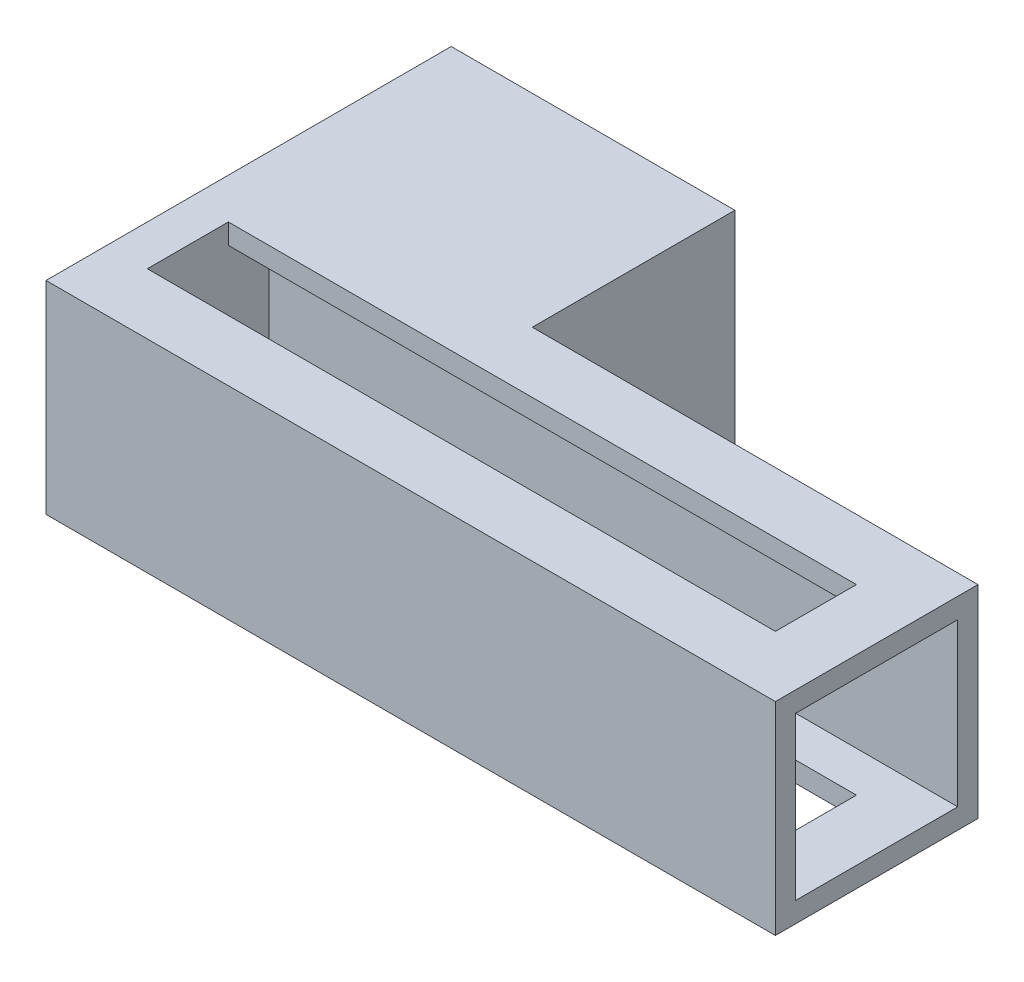
ISO-10303-21;
HEADER;
FILE_DESCRIPTION(('STEP AP214'),'2;1');
FILE_NAME('part.step','',(''),(''),'','','');
FILE_SCHEMA(('AUTOMOTIVE_DESIGN { 1 0 10303 214 1 1 1 1 }'));
ENDSEC;
DATA;
#1=APPLICATION_CONTEXT('core data for automotive mechanical design processes');
#2=APPLICATION_PROTOCOL_DEFINITION('international standard','automotive_design',2000,#1);
#3=PRODUCT_CONTEXT('',#1,'mechanical');
#4=PRODUCT('Part','Part','',(#3));
#5=PRODUCT_RELATED_PRODUCT_CATEGORY('part','',(#4));
#6=PRODUCT_DEFINITION_FORMATION('','',#4);
#7=PRODUCT_DEFINITION_CONTEXT('part definition',#1,'design');
#8=PRODUCT_DEFINITION('design','',#6,#7);
#9=PRODUCT_DEFINITION_SHAPE('','',#8);
#10=(LENGTH_UNIT() NAMED_UNIT(*) SI_UNIT(.MILLI.,.METRE.));
#11=(NAMED_UNIT(*) PLANE_ANGLE_UNIT() SI_UNIT($,.RADIAN.));
#12=(NAMED_UNIT(*) SI_UNIT($,.STERADIAN.) SOLID_ANGLE_UNIT());
#13=UNCERTAINTY_MEASURE_WITH_UNIT(LENGTH_MEASURE(1.E-05),#10,'distance_accuracy_value','');
#14=(GEOMETRIC_REPRESENTATION_CONTEXT(3) GLOBAL_UNCERTAINTY_ASSIGNED_CONTEXT((#13)) GLOBAL_UNIT_ASSIGNED_CONTEXT((#10,
#11,#12)) REPRESENTATION_CONTEXT('',''));
#15=CARTESIAN_POINT('',(0.,0.,0.));
#16=DIRECTION('',(0.,0.,1.));
#17=DIRECTION('',(1.,0.,0.));
#18=AXIS2_PLACEMENT_3D('',#15,#16,#17);
#19=CARTESIAN_POINT('',(35.,-25.,50.));
#20=DIRECTION('',(-1.,0.,0.));
#21=DIRECTION('',(0.,0.,1.));
#22=AXIS2_PLACEMENT_3D('',#19,#20,#21);
#23=PLANE('',#22);
#24=DIRECTION('',(0.,1.,0.));
#25=VECTOR('',#24,1.);
#26=CARTESIAN_POINT('',(35.,-25.,0.));
#27=LINE('',#26,#25);
#28=CARTESIAN_POINT('',(35.,-25.,0.));
#29=VERTEX_POINT('',#28);
#30=CARTESIAN_POINT('',(35.,25.,0.));
#31=VERTEX_POINT('',#30);
#32=EDGE_CURVE('E268',#29,#31,#27,.T.);
#33=ORIENTED_EDGE('',*,*,#32,.T.);
#34=DIRECTION('',(0.,0.,-1.));
#35=VECTOR('',#34,1.);
#36=CARTESIAN_POINT('',(35.,25.,50.));
#37=LINE('',#36,#35);
#38=CARTESIAN_POINT('',(35.,25.,50.));
#39=VERTEX_POINT('',#38);
#40=EDGE_CURVE('E40',#39,#31,#37,.T.);
#41=ORIENTED_EDGE('',*,*,#40,.F.);
#42=DIRECTION('',(0.,1.,0.));
#43=VECTOR('',#42,1.);
#44=CARTESIAN_POINT('',(35.,-25.,50.));
#45=LINE('',#44,#43);
#46=CARTESIAN_POINT('',(35.,-25.,50.));
#47=VERTEX_POINT('',#46);
#48=EDGE_CURVE('E277',#47,#39,#45,.T.);
#49=ORIENTED_EDGE('',*,*,#48,.F.);
#50=DIRECTION('',(0.,0.,-1.));
#51=VECTOR('',#50,1.);
#52=CARTESIAN_POINT('',(35.,-25.,50.));
#53=LINE('',#52,#51);
#54=EDGE_CURVE('E280',#47,#29,#53,.T.);
#55=ORIENTED_EDGE('',*,*,#54,.T.);
#56=EDGE_LOOP('',(#33,#41,#49,#55));
#57=FACE_BOUND('',#56,.T.);
#58=ADVANCED_FACE('F33',(#57),#23,.F.);
#59=CARTESIAN_POINT('',(-35.,25.,50.));
#60=DIRECTION('',(0.,-1.,0.));
#61=DIRECTION('',(0.,0.,-1.));
#62=AXIS2_PLACEMENT_3D('',#59,#60,#61);
#63=PLANE('',#62);
#64=DIRECTION('',(1.,0.,0.));
#65=VECTOR('',#64,1.);
#66=CARTESIAN_POINT('',(60.,25.,65.));
#67=LINE('',#66,#65);
#68=CARTESIAN_POINT('',(-25.,25.,65.));
#69=VERTEX_POINT('',#68);
#70=CARTESIAN_POINT('',(130.,25.,65.));
#71=VERTEX_POINT('',#70);
#72=EDGE_CURVE('E170',#69,#71,#67,.T.);
#73=ORIENTED_EDGE('',*,*,#72,.T.);
#74=DIRECTION('',(0.,0.,1.));
#75=VECTOR('',#74,1.);
#76=CARTESIAN_POINT('',(130.,25.,85.));
#77=LINE('',#76,#75);
#78=CARTESIAN_POINT('',(130.,25.,85.));
#79=VERTEX_POINT('',#78);
#80=EDGE_CURVE('E177',#71,#79,#77,.T.);
#81=ORIENTED_EDGE('',*,*,#80,.T.);
#82=DIRECTION('',(-1.,0.,0.));
#83=VECTOR('',#82,1.);
#84=CARTESIAN_POINT('',(60.,25.,85.));
#85=LINE('',#84,#83);
#86=CARTESIAN_POINT('',(-25.,25.,85.));
#87=VERTEX_POINT('',#86);
#88=EDGE_CURVE('E183',#79,#87,#85,.T.);
#89=ORIENTED_EDGE('',*,*,#88,.T.);
#90=DIRECTION('',(0.,0.,-1.));
#91=VECTOR('',#90,1.);
#92=CARTESIAN_POINT('',(-25.,25.,85.));
#93=LINE('',#92,#91);
#94=EDGE_CURVE('E47',#87,#69,#93,.T.);
#95=ORIENTED_EDGE('',*,*,#94,.T.);
#96=EDGE_LOOP('',(#73,#81,#89,#95));
#97=FACE_BOUND('',#96,.T.);
#98=DIRECTION('',(-1.,0.,0.));
#99=VECTOR('',#98,1.);
#100=CARTESIAN_POINT('',(-35.,25.,0.));
#101=LINE('',#100,#99);
#102=CARTESIAN_POINT('',(-35.,25.,0.));
#103=VERTEX_POINT('',#102);
#104=EDGE_CURVE('E284',#31,#103,#101,.T.);
#105=ORIENTED_EDGE('',*,*,#104,.T.);
#106=DIRECTION('',(0.,0.,-1.));
#107=VECTOR('',#106,1.);
#108=CARTESIAN_POINT('',(-35.,25.,50.));
#109=LINE('',#108,#107);
#110=CARTESIAN_POINT('',(-35.,25.,100.));
#111=VERTEX_POINT('',#110);
#112=EDGE_CURVE('E294',#111,#103,#109,.T.);
#113=ORIENTED_EDGE('',*,*,#112,.F.);
#114=DIRECTION('',(-1.,0.,0.));
#115=VECTOR('',#114,1.);
#116=CARTESIAN_POINT('',(145.,25.,100.));
#117=LINE('',#116,#115);
#118=CARTESIAN_POINT('',(145.,25.,100.));
#119=VERTEX_POINT('',#118);
#120=EDGE_CURVE('E272',#119,#111,#117,.T.);
#121=ORIENTED_EDGE('',*,*,#120,.F.);
#122=DIRECTION('',(0.,0.,-1.));
#123=VECTOR('',#122,1.);
#124=CARTESIAN_POINT('',(145.,25.,50.));
#125=LINE('',#124,#123);
#126=CARTESIAN_POINT('',(145.,25.,50.));
#127=VERTEX_POINT('',#126);
#128=EDGE_CURVE('E256',#119,#127,#125,.T.);
#129=ORIENTED_EDGE('',*,*,#128,.T.);
#130=DIRECTION('',(-1.,0.,0.));
#131=VECTOR('',#130,1.);
#132=CARTESIAN_POINT('',(145.,25.,50.));
#133=LINE('',#132,#131);
#134=EDGE_CURVE('E269',#127,#39,#133,.T.);
#135=ORIENTED_EDGE('',*,*,#134,.T.);
#136=ORIENTED_EDGE('',*,*,#40,.T.);
#137=EDGE_LOOP('',(#105,#113,#121,#129,#135,#136));
#138=FACE_BOUND('',#137,.T.);
#139=ADVANCED_FACE('F180',(#97,#138),#63,.F.);
#140=CARTESIAN_POINT('',(-35.,-25.,50.));
#141=DIRECTION('',(1.,0.,0.));
#142=DIRECTION('',(0.,0.,-1.));
#143=AXIS2_PLACEMENT_3D('',#140,#141,#142);
#144=PLANE('',#143);
#145=DIRECTION('',(0.,-1.,0.));
#146=VECTOR('',#145,1.);
#147=CARTESIAN_POINT('',(-35.,-25.,0.));
#148=LINE('',#147,#146);
#149=CARTESIAN_POINT('',(-35.,-25.,0.));
#150=VERTEX_POINT('',#149);
#151=EDGE_CURVE('E286',#103,#150,#148,.T.);
#152=ORIENTED_EDGE('',*,*,#151,.T.);
#153=DIRECTION('',(0.,0.,-1.));
#154=VECTOR('',#153,1.);
#155=CARTESIAN_POINT('',(-35.,-25.,50.));
#156=LINE('',#155,#154);
#157=CARTESIAN_POINT('',(-35.,-25.,100.));
#158=VERTEX_POINT('',#157);
#159=EDGE_CURVE('E291',#158,#150,#156,.T.);
#160=ORIENTED_EDGE('',*,*,#159,.F.);
#161=DIRECTION('',(0.,1.,0.));
#162=VECTOR('',#161,1.);
#163=CARTESIAN_POINT('',(-35.,25.,100.));
#164=LINE('',#163,#162);
#165=EDGE_CURVE('E243',#158,#111,#164,.T.);
#166=ORIENTED_EDGE('',*,*,#165,.T.);
#167=ORIENTED_EDGE('',*,*,#112,.T.);
#168=EDGE_LOOP('',(#152,#160,#166,#167));
#169=FACE_BOUND('',#168,.T.);
#170=ADVANCED_FACE('F305',(#169),#144,.F.);
#171=CARTESIAN_POINT('',(-35.,-25.,50.));
#172=DIRECTION('',(0.,1.,0.));
#173=DIRECTION('',(0.,0.,1.));
#174=AXIS2_PLACEMENT_3D('',#171,#172,#173);
#175=PLANE('',#174);
#176=DIRECTION('',(-1.,0.,0.));
#177=VECTOR('',#176,1.);
#178=CARTESIAN_POINT('',(60.,-25.,85.));
#179=LINE('',#178,#177);
#180=CARTESIAN_POINT('',(130.,-25.,85.));
#181=VERTEX_POINT('',#180);
#182=CARTESIAN_POINT('',(-25.,-25.,85.));
#183=VERTEX_POINT('',#182);
#184=EDGE_CURVE('E189',#181,#183,#179,.T.);
#185=ORIENTED_EDGE('',*,*,#184,.F.);
#186=DIRECTION('',(0.,0.,1.));
#187=VECTOR('',#186,1.);
#188=CARTESIAN_POINT('',(130.,-25.,85.));
#189=LINE('',#188,#187);
#190=CARTESIAN_POINT('',(130.,-25.,65.));
#191=VERTEX_POINT('',#190);
#192=EDGE_CURVE('E55',#191,#181,#189,.T.);
#193=ORIENTED_EDGE('',*,*,#192,.F.);
#194=DIRECTION('',(1.,0.,0.));
#195=VECTOR('',#194,1.);
#196=CARTESIAN_POINT('',(60.,-25.,65.));
#197=LINE('',#196,#195);
#198=CARTESIAN_POINT('',(-25.,-25.,65.));
#199=VERTEX_POINT('',#198);
#200=EDGE_CURVE('E195',#199,#191,#197,.T.);
#201=ORIENTED_EDGE('',*,*,#200,.F.);
#202=DIRECTION('',(0.,0.,-1.));
#203=VECTOR('',#202,1.);
#204=CARTESIAN_POINT('',(-25.,-25.,85.));
#205=LINE('',#204,#203);
#206=EDGE_CURVE('E192',#183,#199,#205,.T.);
#207=ORIENTED_EDGE('',*,*,#206,.F.);
#208=EDGE_LOOP('',(#185,#193,#201,#207));
#209=FACE_BOUND('',#208,.T.);
#210=DIRECTION('',(1.,0.,0.));
#211=VECTOR('',#210,1.);
#212=CARTESIAN_POINT('',(-35.,-25.,0.));
#213=LINE('',#212,#211);
#214=EDGE_CURVE('E281',#150,#29,#213,.T.);
#215=ORIENTED_EDGE('',*,*,#214,.T.);
#216=ORIENTED_EDGE('',*,*,#54,.F.);
#217=DIRECTION('',(-1.,0.,0.));
#218=VECTOR('',#217,1.);
#219=CARTESIAN_POINT('',(145.,-25.,50.));
#220=LINE('',#219,#218);
#221=CARTESIAN_POINT('',(145.,-25.,50.));
#222=VERTEX_POINT('',#221);
#223=EDGE_CURVE('E265',#222,#47,#220,.T.);
#224=ORIENTED_EDGE('',*,*,#223,.F.);
#225=DIRECTION('',(0.,0.,1.));
#226=VECTOR('',#225,1.);
#227=CARTESIAN_POINT('',(145.,-25.,100.));
#228=LINE('',#227,#226);
#229=CARTESIAN_POINT('',(145.,-25.,100.));
#230=VERTEX_POINT('',#229);
#231=EDGE_CURVE('E250',#222,#230,#228,.T.);
#232=ORIENTED_EDGE('',*,*,#231,.T.);
#233=DIRECTION('',(-1.,0.,0.));
#234=VECTOR('',#233,1.);
#235=CARTESIAN_POINT('',(145.,-25.,100.));
#236=LINE('',#235,#234);
#237=EDGE_CURVE('E262',#230,#158,#236,.T.);
#238=ORIENTED_EDGE('',*,*,#237,.T.);
#239=ORIENTED_EDGE('',*,*,#159,.T.);
#240=EDGE_LOOP('',(#215,#216,#224,#232,#238,#239));
#241=FACE_BOUND('',#240,.T.);
#242=ADVANCED_FACE('F307',(#209,#241),#175,.F.);
#243=CARTESIAN_POINT('',(0.,0.,0.));
#244=DIRECTION('',(0.,0.,-1.));
#245=DIRECTION('',(-1.,0.,0.));
#246=AXIS2_PLACEMENT_3D('',#243,#244,#245);
#247=PLANE('',#246);
#248=ORIENTED_EDGE('',*,*,#32,.F.);
#249=ORIENTED_EDGE('',*,*,#214,.F.);
#250=ORIENTED_EDGE('',*,*,#151,.F.);
#251=ORIENTED_EDGE('',*,*,#104,.F.);
#252=EDGE_LOOP('',(#248,#249,#250,#251));
#253=FACE_BOUND('',#252,.T.);
#254=ADVANCED_FACE('F302',(#253),#247,.T.);
#255=CARTESIAN_POINT('',(145.,-25.,50.));
#256=DIRECTION('',(0.,0.,-1.));
#257=DIRECTION('',(-1.,0.,0.));
#258=AXIS2_PLACEMENT_3D('',#255,#256,#257);
#259=PLANE('',#258);
#260=ORIENTED_EDGE('',*,*,#223,.T.);
#261=ORIENTED_EDGE('',*,*,#48,.T.);
#262=ORIENTED_EDGE('',*,*,#134,.F.);
#263=DIRECTION('',(0.,-1.,0.));
#264=VECTOR('',#263,1.);
#265=CARTESIAN_POINT('',(145.,-25.,50.));
#266=LINE('',#265,#264);
#267=EDGE_CURVE('E259',#127,#222,#266,.T.);
#268=ORIENTED_EDGE('',*,*,#267,.T.);
#269=EDGE_LOOP('',(#260,#261,#262,#268));
#270=FACE_BOUND('',#269,.T.);
#271=ADVANCED_FACE('F318',(#270),#259,.T.);
#272=CARTESIAN_POINT('',(145.,25.,100.));
#273=DIRECTION('',(0.,0.,1.));
#274=DIRECTION('',(1.,0.,0.));
#275=AXIS2_PLACEMENT_3D('',#272,#273,#274);
#276=PLANE('',#275);
#277=ORIENTED_EDGE('',*,*,#165,.F.);
#278=ORIENTED_EDGE('',*,*,#237,.F.);
#279=DIRECTION('',(0.,1.,0.));
#280=VECTOR('',#279,1.);
#281=CARTESIAN_POINT('',(145.,25.,100.));
#282=LINE('',#281,#280);
#283=EDGE_CURVE('E253',#230,#119,#282,.T.);
#284=ORIENTED_EDGE('',*,*,#283,.T.);
#285=ORIENTED_EDGE('',*,*,#120,.T.);
#286=EDGE_LOOP('',(#277,#278,#284,#285));
#287=FACE_BOUND('',#286,.T.);
#288=ADVANCED_FACE('F312',(#287),#276,.T.);
#289=CARTESIAN_POINT('',(145.,0.,0.));
#290=DIRECTION('',(1.,0.,0.));
#291=DIRECTION('',(0.,0.,-1.));
#292=AXIS2_PLACEMENT_3D('',#289,#290,#291);
#293=PLANE('',#292);
#294=DIRECTION('',(0.,-1.,0.));
#295=VECTOR('',#294,1.);
#296=CARTESIAN_POINT('',(145.,20.,95.));
#297=LINE('',#296,#295);
#298=CARTESIAN_POINT('',(145.,20.,95.));
#299=VERTEX_POINT('',#298);
#300=CARTESIAN_POINT('',(145.,-20.,95.));
#301=VERTEX_POINT('',#300);
#302=EDGE_CURVE('E219',#299,#301,#297,.T.);
#303=ORIENTED_EDGE('',*,*,#302,.F.);
#304=DIRECTION('',(0.,0.,1.));
#305=VECTOR('',#304,1.);
#306=CARTESIAN_POINT('',(145.,20.,55.));
#307=LINE('',#306,#305);
#308=CARTESIAN_POINT('',(145.,20.,55.));
#309=VERTEX_POINT('',#308);
#310=EDGE_CURVE('E224',#309,#299,#307,.T.);
#311=ORIENTED_EDGE('',*,*,#310,.F.);
#312=DIRECTION('',(0.,1.,0.));
#313=VECTOR('',#312,1.);
#314=CARTESIAN_POINT('',(145.,20.,55.));
#315=LINE('',#314,#313);
#316=CARTESIAN_POINT('',(145.,-20.,55.));
#317=VERTEX_POINT('',#316);
#318=EDGE_CURVE('E236',#317,#309,#315,.T.);
#319=ORIENTED_EDGE('',*,*,#318,.F.);
#320=DIRECTION('',(0.,0.,-1.));
#321=VECTOR('',#320,1.);
#322=CARTESIAN_POINT('',(145.,-20.,55.));
#323=LINE('',#322,#321);
#324=EDGE_CURVE('E233',#301,#317,#323,.T.);
#325=ORIENTED_EDGE('',*,*,#324,.F.);
#326=EDGE_LOOP('',(#303,#311,#319,#325));
#327=FACE_BOUND('',#326,.T.);
#328=ORIENTED_EDGE('',*,*,#231,.F.);
#329=ORIENTED_EDGE('',*,*,#267,.F.);
#330=ORIENTED_EDGE('',*,*,#128,.F.);
#331=ORIENTED_EDGE('',*,*,#283,.F.);
#332=EDGE_LOOP('',(#328,#329,#330,#331));
#333=FACE_BOUND('',#332,.T.);
#334=ADVANCED_FACE('F316',(#327,#333),#293,.T.);
#335=CARTESIAN_POINT('',(-25.,20.,95.));
#336=DIRECTION('',(0.,0.,1.));
#337=DIRECTION('',(1.,0.,0.));
#338=AXIS2_PLACEMENT_3D('',#335,#336,#337);
#339=PLANE('',#338);
#340=ORIENTED_EDGE('',*,*,#302,.T.);
#341=DIRECTION('',(1.,0.,0.));
#342=VECTOR('',#341,1.);
#343=CARTESIAN_POINT('',(-25.,-20.,95.));
#344=LINE('',#343,#342);
#345=CARTESIAN_POINT('',(-25.,-20.,95.));
#346=VERTEX_POINT('',#345);
#347=EDGE_CURVE('E231',#346,#301,#344,.T.);
#348=ORIENTED_EDGE('',*,*,#347,.F.);
#349=DIRECTION('',(0.,-1.,0.));
#350=VECTOR('',#349,1.);
#351=CARTESIAN_POINT('',(-25.,20.,95.));
#352=LINE('',#351,#350);
#353=CARTESIAN_POINT('',(-25.,20.,95.));
#354=VERTEX_POINT('',#353);
#355=EDGE_CURVE('E220',#354,#346,#352,.T.);
#356=ORIENTED_EDGE('',*,*,#355,.F.);
#357=DIRECTION('',(1.,0.,0.));
#358=VECTOR('',#357,1.);
#359=CARTESIAN_POINT('',(-25.,20.,95.));
#360=LINE('',#359,#358);
#361=EDGE_CURVE('E241',#354,#299,#360,.T.);
#362=ORIENTED_EDGE('',*,*,#361,.T.);
#363=EDGE_LOOP('',(#340,#348,#356,#362));
#364=FACE_BOUND('',#363,.T.);
#365=ADVANCED_FACE('F375',(#364),#339,.F.);
#366=CARTESIAN_POINT('',(-25.,20.,55.));
#367=DIRECTION('',(0.,1.,0.));
#368=DIRECTION('',(0.,0.,1.));
#369=AXIS2_PLACEMENT_3D('',#366,#367,#368);
#370=PLANE('',#369);
#371=DIRECTION('',(0.,0.,-1.));
#372=VECTOR('',#371,1.);
#373=CARTESIAN_POINT('',(130.,20.,55.));
#374=LINE('',#373,#372);
#375=CARTESIAN_POINT('',(130.,20.,85.));
#376=VERTEX_POINT('',#375);
#377=CARTESIAN_POINT('',(130.,20.,65.));
#378=VERTEX_POINT('',#377);
#379=EDGE_CURVE('E216',#376,#378,#374,.T.);
#380=ORIENTED_EDGE('',*,*,#379,.T.);
#381=DIRECTION('',(-1.,0.,0.));
#382=VECTOR('',#381,1.);
#383=CARTESIAN_POINT('',(-25.,20.,65.));
#384=LINE('',#383,#382);
#385=CARTESIAN_POINT('',(-25.,20.,65.));
#386=VERTEX_POINT('',#385);
#387=EDGE_CURVE('E214',#378,#386,#384,.T.);
#388=ORIENTED_EDGE('',*,*,#387,.T.);
#389=DIRECTION('',(0.,0.,1.));
#390=VECTOR('',#389,1.);
#391=CARTESIAN_POINT('',(-25.,20.,55.));
#392=LINE('',#391,#390);
#393=CARTESIAN_POINT('',(-25.,20.,55.));
#394=VERTEX_POINT('',#393);
#395=EDGE_CURVE('E163',#394,#386,#392,.T.);
#396=ORIENTED_EDGE('',*,*,#395,.F.);
#397=DIRECTION('',(1.,0.,0.));
#398=VECTOR('',#397,1.);
#399=CARTESIAN_POINT('',(-25.,20.,55.));
#400=LINE('',#399,#398);
#401=EDGE_CURVE('E244',#394,#309,#400,.T.);
#402=ORIENTED_EDGE('',*,*,#401,.T.);
#403=ORIENTED_EDGE('',*,*,#310,.T.);
#404=ORIENTED_EDGE('',*,*,#361,.F.);
#405=CARTESIAN_POINT('',(-25.,20.,85.));
#406=VERTEX_POINT('',#405);
#407=EDGE_CURVE('E229',#406,#354,#392,.T.);
#408=ORIENTED_EDGE('',*,*,#407,.F.);
#409=DIRECTION('',(1.,0.,0.));
#410=VECTOR('',#409,1.);
#411=CARTESIAN_POINT('',(-25.,20.,85.));
#412=LINE('',#411,#410);
#413=EDGE_CURVE('E208',#406,#376,#412,.T.);
#414=ORIENTED_EDGE('',*,*,#413,.T.);
#415=EDGE_LOOP('',(#380,#388,#396,#402,#403,#404,#408,#414));
#416=FACE_BOUND('',#415,.T.);
#417=ADVANCED_FACE('F367',(#416),#370,.F.);
#418=CARTESIAN_POINT('',(-25.,20.,55.));
#419=DIRECTION('',(0.,0.,-1.));
#420=DIRECTION('',(-1.,0.,0.));
#421=AXIS2_PLACEMENT_3D('',#418,#419,#420);
#422=PLANE('',#421);
#423=ORIENTED_EDGE('',*,*,#318,.T.);
#424=ORIENTED_EDGE('',*,*,#401,.F.);
#425=DIRECTION('',(0.,1.,0.));
#426=VECTOR('',#425,1.);
#427=CARTESIAN_POINT('',(-25.,20.,55.));
#428=LINE('',#427,#426);
#429=CARTESIAN_POINT('',(-25.,-20.,55.));
#430=VERTEX_POINT('',#429);
#431=EDGE_CURVE('E227',#430,#394,#428,.T.);
#432=ORIENTED_EDGE('',*,*,#431,.F.);
#433=DIRECTION('',(1.,0.,0.));
#434=VECTOR('',#433,1.);
#435=CARTESIAN_POINT('',(-25.,-20.,55.));
#436=LINE('',#435,#434);
#437=EDGE_CURVE('E246',#430,#317,#436,.T.);
#438=ORIENTED_EDGE('',*,*,#437,.T.);
#439=EDGE_LOOP('',(#423,#424,#432,#438));
#440=FACE_BOUND('',#439,.T.);
#441=ADVANCED_FACE('F364',(#440),#422,.F.);
#442=CARTESIAN_POINT('',(-25.,-20.,55.));
#443=DIRECTION('',(0.,-1.,0.));
#444=DIRECTION('',(0.,0.,-1.));
#445=AXIS2_PLACEMENT_3D('',#442,#443,#444);
#446=PLANE('',#445);
#447=DIRECTION('',(0.,0.,-1.));
#448=VECTOR('',#447,1.);
#449=CARTESIAN_POINT('',(-25.,-20.,55.));
#450=LINE('',#449,#448);
#451=CARTESIAN_POINT('',(-25.,-20.,65.));
#452=VERTEX_POINT('',#451);
#453=EDGE_CURVE('E223',#452,#430,#450,.T.);
#454=ORIENTED_EDGE('',*,*,#453,.F.);
#455=DIRECTION('',(1.,0.,0.));
#456=VECTOR('',#455,1.);
#457=CARTESIAN_POINT('',(-25.,-20.,65.));
#458=LINE('',#457,#456);
#459=CARTESIAN_POINT('',(130.,-20.,65.));
#460=VERTEX_POINT('',#459);
#461=EDGE_CURVE('E211',#452,#460,#458,.T.);
#462=ORIENTED_EDGE('',*,*,#461,.T.);
#463=DIRECTION('',(0.,0.,1.));
#464=VECTOR('',#463,1.);
#465=CARTESIAN_POINT('',(130.,-20.,55.));
#466=LINE('',#465,#464);
#467=CARTESIAN_POINT('',(130.,-20.,85.));
#468=VERTEX_POINT('',#467);
#469=EDGE_CURVE('E11',#460,#468,#466,.T.);
#470=ORIENTED_EDGE('',*,*,#469,.T.);
#471=DIRECTION('',(-1.,0.,0.));
#472=VECTOR('',#471,1.);
#473=CARTESIAN_POINT('',(-25.,-20.,85.));
#474=LINE('',#473,#472);
#475=CARTESIAN_POINT('',(-25.,-20.,85.));
#476=VERTEX_POINT('',#475);
#477=EDGE_CURVE('E201',#468,#476,#474,.T.);
#478=ORIENTED_EDGE('',*,*,#477,.T.);
#479=EDGE_CURVE('E225',#346,#476,#450,.T.);
#480=ORIENTED_EDGE('',*,*,#479,.F.);
#481=ORIENTED_EDGE('',*,*,#347,.T.);
#482=ORIENTED_EDGE('',*,*,#324,.T.);
#483=ORIENTED_EDGE('',*,*,#437,.F.);
#484=EDGE_LOOP('',(#454,#462,#470,#478,#480,#481,#482,#483));
#485=FACE_BOUND('',#484,.T.);
#486=ADVANCED_FACE('F350',(#485),#446,.F.);
#487=CARTESIAN_POINT('',(-25.,0.,0.));
#488=DIRECTION('',(-1.,0.,0.));
#489=DIRECTION('',(0.,0.,1.));
#490=AXIS2_PLACEMENT_3D('',#487,#488,#489);
#491=PLANE('',#490);
#492=ORIENTED_EDGE('',*,*,#479,.T.);
#493=DIRECTION('',(0.,-1.,0.));
#494=VECTOR('',#493,1.);
#495=CARTESIAN_POINT('',(-25.,25.,85.));
#496=LINE('',#495,#494);
#497=EDGE_CURVE('E188',#476,#183,#496,.T.);
#498=ORIENTED_EDGE('',*,*,#497,.T.);
#499=ORIENTED_EDGE('',*,*,#206,.T.);
#500=DIRECTION('',(0.,-1.,0.));
#501=VECTOR('',#500,1.);
#502=CARTESIAN_POINT('',(-25.,25.,65.));
#503=LINE('',#502,#501);
#504=EDGE_CURVE('E167',#452,#199,#503,.T.);
#505=ORIENTED_EDGE('',*,*,#504,.F.);
#506=ORIENTED_EDGE('',*,*,#453,.T.);
#507=ORIENTED_EDGE('',*,*,#431,.T.);
#508=ORIENTED_EDGE('',*,*,#395,.T.);
#509=EDGE_CURVE('E157',#69,#386,#503,.T.);
#510=ORIENTED_EDGE('',*,*,#509,.F.);
#511=ORIENTED_EDGE('',*,*,#94,.F.);
#512=EDGE_CURVE('E204',#87,#406,#496,.T.);
#513=ORIENTED_EDGE('',*,*,#512,.T.);
#514=ORIENTED_EDGE('',*,*,#407,.T.);
#515=ORIENTED_EDGE('',*,*,#355,.T.);
#516=EDGE_LOOP('',(#492,#498,#499,#505,#506,#507,#508,#510,#511,#513,#514,#515));
#517=FACE_BOUND('',#516,.T.);
#518=ADVANCED_FACE('F160',(#517),#491,.F.);
#519=CARTESIAN_POINT('',(60.,25.,85.));
#520=DIRECTION('',(0.,0.,1.));
#521=DIRECTION('',(1.,0.,0.));
#522=AXIS2_PLACEMENT_3D('',#519,#520,#521);
#523=PLANE('',#522);
#524=DIRECTION('',(0.,-1.,0.));
#525=VECTOR('',#524,1.);
#526=CARTESIAN_POINT('',(130.,25.,85.));
#527=LINE('',#526,#525);
#528=EDGE_CURVE('E202',#468,#181,#527,.T.);
#529=ORIENTED_EDGE('',*,*,#528,.T.);
#530=ORIENTED_EDGE('',*,*,#184,.T.);
#531=ORIENTED_EDGE('',*,*,#497,.F.);
#532=ORIENTED_EDGE('',*,*,#477,.F.);
#533=EDGE_LOOP('',(#529,#530,#531,#532));
#534=FACE_BOUND('',#533,.T.);
#535=ADVANCED_FACE('F345',(#534),#523,.F.);
#536=CARTESIAN_POINT('',(60.,25.,65.));
#537=DIRECTION('',(0.,0.,-1.));
#538=DIRECTION('',(-1.,0.,0.));
#539=AXIS2_PLACEMENT_3D('',#536,#537,#538);
#540=PLANE('',#539);
#541=ORIENTED_EDGE('',*,*,#504,.T.);
#542=ORIENTED_EDGE('',*,*,#200,.T.);
#543=DIRECTION('',(0.,-1.,0.));
#544=VECTOR('',#543,1.);
#545=CARTESIAN_POINT('',(130.,25.,65.));
#546=LINE('',#545,#544);
#547=EDGE_CURVE('E166',#460,#191,#546,.T.);
#548=ORIENTED_EDGE('',*,*,#547,.F.);
#549=ORIENTED_EDGE('',*,*,#461,.F.);
#550=EDGE_LOOP('',(#541,#542,#548,#549));
#551=FACE_BOUND('',#550,.T.);
#552=ADVANCED_FACE('F355',(#551),#540,.F.);
#553=CARTESIAN_POINT('',(130.,25.,85.));
#554=DIRECTION('',(1.,0.,0.));
#555=DIRECTION('',(0.,0.,-1.));
#556=AXIS2_PLACEMENT_3D('',#553,#554,#555);
#557=PLANE('',#556);
#558=ORIENTED_EDGE('',*,*,#547,.T.);
#559=ORIENTED_EDGE('',*,*,#192,.T.);
#560=ORIENTED_EDGE('',*,*,#528,.F.);
#561=ORIENTED_EDGE('',*,*,#469,.F.);
#562=EDGE_LOOP('',(#558,#559,#560,#561));
#563=FACE_BOUND('',#562,.T.);
#564=ADVANCED_FACE('F346',(#563),#557,.F.);
#565=EDGE_CURVE('E199',#79,#376,#527,.T.);
#566=ORIENTED_EDGE('',*,*,#565,.F.);
#567=ORIENTED_EDGE('',*,*,#80,.F.);
#568=EDGE_CURVE('E173',#71,#378,#546,.T.);
#569=ORIENTED_EDGE('',*,*,#568,.T.);
#570=ORIENTED_EDGE('',*,*,#379,.F.);
#571=EDGE_LOOP('',(#566,#567,#569,#570));
#572=FACE_BOUND('',#571,.T.);
#573=ADVANCED_FACE('F370',(#572),#557,.F.);
#574=ORIENTED_EDGE('',*,*,#568,.F.);
#575=ORIENTED_EDGE('',*,*,#72,.F.);
#576=ORIENTED_EDGE('',*,*,#509,.T.);
#577=ORIENTED_EDGE('',*,*,#387,.F.);
#578=EDGE_LOOP('',(#574,#575,#576,#577));
#579=FACE_BOUND('',#578,.T.);
#580=ADVANCED_FACE('F171',(#579),#540,.F.);
#581=ORIENTED_EDGE('',*,*,#512,.F.);
#582=ORIENTED_EDGE('',*,*,#88,.F.);
#583=ORIENTED_EDGE('',*,*,#565,.T.);
#584=ORIENTED_EDGE('',*,*,#413,.F.);
#585=EDGE_LOOP('',(#581,#582,#583,#584));
#586=FACE_BOUND('',#585,.T.);
#587=ADVANCED_FACE('F372',(#586),#523,.F.);
#588=CLOSED_SHELL('',(#58,#139,#170,#242,#254,#271,#288,#334,#365,#417,#441,#486,#518,#535,#552,
#564,#573,#580,#587));
#589=MANIFOLD_SOLID_BREP('B2',#588);
#590=ADVANCED_BREP_SHAPE_REPRESENTATION('',(#18,#589),#14);
#591=SHAPE_DEFINITION_REPRESENTATION(#9,#590);
ENDSEC;
END-ISO-10303-21;
